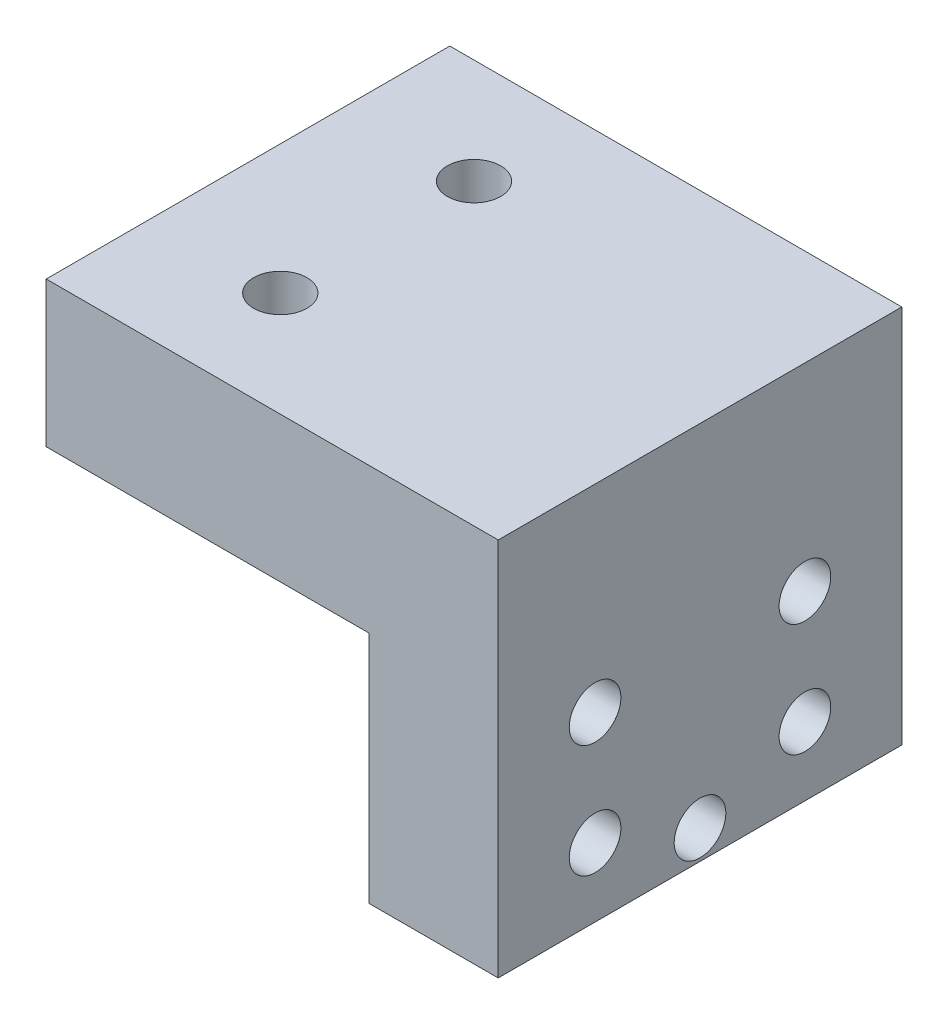
ISO-10303-21;
HEADER;
FILE_DESCRIPTION(('STEP AP214'),'2;1');
FILE_NAME('part.step','',(''),(''),'','','');
FILE_SCHEMA(('AUTOMOTIVE_DESIGN { 1 0 10303 214 1 1 1 1 }'));
ENDSEC;
DATA;
#1=APPLICATION_CONTEXT('core data for automotive mechanical design processes');
#2=APPLICATION_PROTOCOL_DEFINITION('international standard','automotive_design',2000,#1);
#3=PRODUCT_CONTEXT('',#1,'mechanical');
#4=PRODUCT('Part','Part','',(#3));
#5=PRODUCT_RELATED_PRODUCT_CATEGORY('part','',(#4));
#6=PRODUCT_DEFINITION_FORMATION('','',#4);
#7=PRODUCT_DEFINITION_CONTEXT('part definition',#1,'design');
#8=PRODUCT_DEFINITION('design','',#6,#7);
#9=PRODUCT_DEFINITION_SHAPE('','',#8);
#10=(LENGTH_UNIT() NAMED_UNIT(*) SI_UNIT(.MILLI.,.METRE.));
#11=(NAMED_UNIT(*) PLANE_ANGLE_UNIT() SI_UNIT($,.RADIAN.));
#12=(NAMED_UNIT(*) SI_UNIT($,.STERADIAN.) SOLID_ANGLE_UNIT());
#13=UNCERTAINTY_MEASURE_WITH_UNIT(LENGTH_MEASURE(1.E-05),#10,'distance_accuracy_value','');
#14=(GEOMETRIC_REPRESENTATION_CONTEXT(3) GLOBAL_UNCERTAINTY_ASSIGNED_CONTEXT((#13)) GLOBAL_UNIT_ASSIGNED_CONTEXT((#10,
#11,#12)) REPRESENTATION_CONTEXT('',''));
#15=CARTESIAN_POINT('',(0.,0.,0.));
#16=DIRECTION('',(0.,0.,1.));
#17=DIRECTION('',(1.,0.,0.));
#18=AXIS2_PLACEMENT_3D('',#15,#16,#17);
#19=CARTESIAN_POINT('',(-8.,14.5,25.));
#20=DIRECTION('',(1.,0.,0.));
#21=DIRECTION('',(0.,1.,0.));
#22=AXIS2_PLACEMENT_3D('',#19,#20,#21);
#23=PLANE('',#22);
#24=CARTESIAN_POINT('',(-8.,4.25,19.));
#25=DIRECTION('',(-1.,0.,0.));
#26=DIRECTION('',(0.,-1.,0.));
#27=AXIS2_PLACEMENT_3D('',#24,#25,#26);
#28=CIRCLE('',#27,1.6);
#29=CARTESIAN_POINT('',(-8.,2.64999999999999,19.));
#30=VERTEX_POINT('',#29);
#31=EDGE_CURVE('E255',#30,#30,#28,.T.);
#32=ORIENTED_EDGE('',*,*,#31,.F.);
#33=EDGE_LOOP('',(#32));
#34=FACE_BOUND('',#33,.T.);
#35=CARTESIAN_POINT('',(-8.,11.25,19.));
#36=DIRECTION('',(-1.,0.,0.));
#37=DIRECTION('',(0.,-1.,0.));
#38=AXIS2_PLACEMENT_3D('',#35,#36,#37);
#39=CIRCLE('',#38,1.6);
#40=CARTESIAN_POINT('',(-8.,9.65,19.));
#41=VERTEX_POINT('',#40);
#42=EDGE_CURVE('E252',#41,#41,#39,.T.);
#43=ORIENTED_EDGE('',*,*,#42,.F.);
#44=EDGE_LOOP('',(#43));
#45=FACE_BOUND('',#44,.T.);
#46=DIRECTION('',(0.,0.,-1.));
#47=VECTOR('',#46,1.);
#48=CARTESIAN_POINT('',(-8.,14.5,25.));
#49=LINE('',#48,#47);
#50=CARTESIAN_POINT('',(-8.,14.5,25.));
#51=VERTEX_POINT('',#50);
#52=CARTESIAN_POINT('',(-8.,14.5,14.7248595461287));
#53=VERTEX_POINT('',#52);
#54=EDGE_CURVE('E131',#51,#53,#49,.T.);
#55=ORIENTED_EDGE('',*,*,#54,.T.);
#56=DIRECTION('',(0.,-1.,0.));
#57=VECTOR('',#56,1.);
#58=CARTESIAN_POINT('',(-8.,22.9386017799159,14.7248595461287));
#59=LINE('',#58,#57);
#60=CARTESIAN_POINT('',(-8.,0.,14.7248595461287));
#61=VERTEX_POINT('',#60);
#62=EDGE_CURVE('E219',#53,#61,#59,.T.);
#63=ORIENTED_EDGE('',*,*,#62,.T.);
#64=DIRECTION('',(0.,0.,-1.));
#65=VECTOR('',#64,1.);
#66=CARTESIAN_POINT('',(-8.,0.,25.));
#67=LINE('',#66,#65);
#68=CARTESIAN_POINT('',(-8.,0.,25.));
#69=VERTEX_POINT('',#68);
#70=EDGE_CURVE('E152',#69,#61,#67,.T.);
#71=ORIENTED_EDGE('',*,*,#70,.F.);
#72=DIRECTION('',(0.,-1.,0.));
#73=VECTOR('',#72,1.);
#74=CARTESIAN_POINT('',(-8.,14.5,25.));
#75=LINE('',#74,#73);
#76=EDGE_CURVE('E64',#51,#69,#75,.T.);
#77=ORIENTED_EDGE('',*,*,#76,.F.);
#78=EDGE_LOOP('',(#55,#63,#71,#77));
#79=FACE_BOUND('',#78,.T.);
#80=ADVANCED_FACE('F34',(#34,#45,#79),#23,.F.);
#81=CARTESIAN_POINT('',(-8.,0.,25.));
#82=DIRECTION('',(0.,1.,0.));
#83=DIRECTION('',(0.,0.,1.));
#84=AXIS2_PLACEMENT_3D('',#81,#82,#83);
#85=PLANE('',#84);
#86=ORIENTED_EDGE('',*,*,#70,.T.);
#87=CARTESIAN_POINT('',(-5.7,0.,12.5));
#88=DIRECTION('',(0.,-1.,0.));
#89=DIRECTION('',(0.,0.,-1.));
#90=AXIS2_PLACEMENT_3D('',#87,#88,#89);
#91=CIRCLE('',#90,3.2);
#92=CARTESIAN_POINT('',(-8.,0.,10.2751404538713));
#93=VERTEX_POINT('',#92);
#94=EDGE_CURVE('E224',#93,#61,#91,.T.);
#95=ORIENTED_EDGE('',*,*,#94,.F.);
#96=CARTESIAN_POINT('',(-8.,0.,0.));
#97=VERTEX_POINT('',#96);
#98=EDGE_CURVE('E92',#93,#97,#67,.T.);
#99=ORIENTED_EDGE('',*,*,#98,.T.);
#100=DIRECTION('',(1.,0.,0.));
#101=VECTOR('',#100,1.);
#102=CARTESIAN_POINT('',(-8.,0.,0.));
#103=LINE('',#102,#101);
#104=CARTESIAN_POINT('',(0.,0.,0.));
#105=VERTEX_POINT('',#104);
#106=EDGE_CURVE('E139',#97,#105,#103,.T.);
#107=ORIENTED_EDGE('',*,*,#106,.T.);
#108=DIRECTION('',(0.,0.,-1.));
#109=VECTOR('',#108,1.);
#110=CARTESIAN_POINT('',(0.,0.,25.));
#111=LINE('',#110,#109);
#112=CARTESIAN_POINT('',(0.,0.,25.));
#113=VERTEX_POINT('',#112);
#114=EDGE_CURVE('E11',#113,#105,#111,.T.);
#115=ORIENTED_EDGE('',*,*,#114,.F.);
#116=DIRECTION('',(1.,0.,0.));
#117=VECTOR('',#116,1.);
#118=CARTESIAN_POINT('',(-8.,0.,25.));
#119=LINE('',#118,#117);
#120=EDGE_CURVE('E151',#69,#113,#119,.T.);
#121=ORIENTED_EDGE('',*,*,#120,.F.);
#122=EDGE_LOOP('',(#86,#95,#99,#107,#115,#121));
#123=FACE_BOUND('',#122,.T.);
#124=ADVANCED_FACE('F36',(#123),#85,.F.);
#125=CARTESIAN_POINT('',(0.,0.,25.));
#126=DIRECTION('',(-1.,0.,0.));
#127=DIRECTION('',(0.,0.,1.));
#128=AXIS2_PLACEMENT_3D('',#125,#126,#127);
#129=PLANE('',#128);
#130=CARTESIAN_POINT('',(0.,4.25,6.));
#131=DIRECTION('',(-1.,0.,0.));
#132=DIRECTION('',(0.,0.,1.));
#133=AXIS2_PLACEMENT_3D('',#130,#131,#132);
#134=CIRCLE('',#133,1.6);
#135=CARTESIAN_POINT('',(0.,4.25,7.6));
#136=VERTEX_POINT('',#135);
#137=EDGE_CURVE('E235',#136,#136,#134,.T.);
#138=ORIENTED_EDGE('',*,*,#137,.T.);
#139=EDGE_LOOP('',(#138));
#140=FACE_BOUND('',#139,.T.);
#141=CARTESIAN_POINT('',(0.,11.25,19.));
#142=DIRECTION('',(-1.,0.,0.));
#143=DIRECTION('',(0.,0.,1.));
#144=AXIS2_PLACEMENT_3D('',#141,#142,#143);
#145=CIRCLE('',#144,1.6);
#146=CARTESIAN_POINT('',(0.,11.25,20.6));
#147=VERTEX_POINT('',#146);
#148=EDGE_CURVE('E239',#147,#147,#145,.T.);
#149=ORIENTED_EDGE('',*,*,#148,.T.);
#150=EDGE_LOOP('',(#149));
#151=FACE_BOUND('',#150,.T.);
#152=CARTESIAN_POINT('',(0.,4.25,19.));
#153=DIRECTION('',(-1.,0.,0.));
#154=DIRECTION('',(0.,0.,1.));
#155=AXIS2_PLACEMENT_3D('',#152,#153,#154);
#156=CIRCLE('',#155,1.6);
#157=CARTESIAN_POINT('',(0.,4.25,20.6));
#158=VERTEX_POINT('',#157);
#159=EDGE_CURVE('E242',#158,#158,#156,.T.);
#160=ORIENTED_EDGE('',*,*,#159,.T.);
#161=EDGE_LOOP('',(#160));
#162=FACE_BOUND('',#161,.T.);
#163=CARTESIAN_POINT('',(0.,1.8,12.5));
#164=DIRECTION('',(-1.,0.,0.));
#165=DIRECTION('',(0.,0.,1.));
#166=AXIS2_PLACEMENT_3D('',#163,#164,#165);
#167=CIRCLE('',#166,1.6);
#168=CARTESIAN_POINT('',(0.,1.8,14.1));
#169=VERTEX_POINT('',#168);
#170=EDGE_CURVE('E245',#169,#169,#167,.T.);
#171=ORIENTED_EDGE('',*,*,#170,.T.);
#172=EDGE_LOOP('',(#171));
#173=FACE_BOUND('',#172,.T.);
#174=CARTESIAN_POINT('',(0.,11.25,6.));
#175=DIRECTION('',(-1.,0.,0.));
#176=DIRECTION('',(0.,0.,1.));
#177=AXIS2_PLACEMENT_3D('',#174,#175,#176);
#178=CIRCLE('',#177,1.6);
#179=CARTESIAN_POINT('',(0.,11.25,7.6));
#180=VERTEX_POINT('',#179);
#181=EDGE_CURVE('E248',#180,#180,#178,.T.);
#182=ORIENTED_EDGE('',*,*,#181,.T.);
#183=EDGE_LOOP('',(#182));
#184=FACE_BOUND('',#183,.T.);
#185=DIRECTION('',(0.,1.,0.));
#186=VECTOR('',#185,1.);
#187=CARTESIAN_POINT('',(0.,0.,0.));
#188=LINE('',#187,#186);
#189=CARTESIAN_POINT('',(0.,23.5,0.));
#190=VERTEX_POINT('',#189);
#191=EDGE_CURVE('E141',#105,#190,#188,.T.);
#192=ORIENTED_EDGE('',*,*,#191,.T.);
#193=DIRECTION('',(0.,0.,-1.));
#194=VECTOR('',#193,1.);
#195=CARTESIAN_POINT('',(0.,23.5,25.));
#196=LINE('',#195,#194);
#197=CARTESIAN_POINT('',(0.,23.5,25.));
#198=VERTEX_POINT('',#197);
#199=EDGE_CURVE('E47',#198,#190,#196,.T.);
#200=ORIENTED_EDGE('',*,*,#199,.F.);
#201=DIRECTION('',(0.,1.,0.));
#202=VECTOR('',#201,1.);
#203=CARTESIAN_POINT('',(0.,0.,25.));
#204=LINE('',#203,#202);
#205=EDGE_CURVE('E100',#113,#198,#204,.T.);
#206=ORIENTED_EDGE('',*,*,#205,.F.);
#207=ORIENTED_EDGE('',*,*,#114,.T.);
#208=EDGE_LOOP('',(#192,#200,#206,#207));
#209=FACE_BOUND('',#208,.T.);
#210=ADVANCED_FACE('F192',(#140,#151,#162,#173,#184,#209),#129,.F.);
#211=CARTESIAN_POINT('',(0.,23.5,25.));
#212=DIRECTION('',(0.,-1.,0.));
#213=DIRECTION('',(1.,0.,0.));
#214=AXIS2_PLACEMENT_3D('',#211,#212,#213);
#215=PLANE('',#214);
#216=CARTESIAN_POINT('',(-20.,23.5,6.5));
#217=DIRECTION('',(0.,1.,0.));
#218=DIRECTION('',(-1.,0.,0.));
#219=AXIS2_PLACEMENT_3D('',#216,#217,#218);
#220=CIRCLE('',#219,1.65);
#221=CARTESIAN_POINT('',(-21.65,23.5,6.5));
#222=VERTEX_POINT('',#221);
#223=EDGE_CURVE('E162',#222,#222,#220,.T.);
#224=ORIENTED_EDGE('',*,*,#223,.F.);
#225=EDGE_LOOP('',(#224));
#226=FACE_BOUND('',#225,.T.);
#227=CARTESIAN_POINT('',(-20.,23.5,18.5));
#228=DIRECTION('',(0.,1.,0.));
#229=DIRECTION('',(-1.,0.,0.));
#230=AXIS2_PLACEMENT_3D('',#227,#228,#229);
#231=CIRCLE('',#230,1.65);
#232=CARTESIAN_POINT('',(-21.65,23.5,18.5));
#233=VERTEX_POINT('',#232);
#234=EDGE_CURVE('E232',#233,#233,#231,.T.);
#235=ORIENTED_EDGE('',*,*,#234,.F.);
#236=EDGE_LOOP('',(#235));
#237=FACE_BOUND('',#236,.T.);
#238=DIRECTION('',(-1.,0.,0.));
#239=VECTOR('',#238,1.);
#240=CARTESIAN_POINT('',(0.,23.5,0.));
#241=LINE('',#240,#239);
#242=CARTESIAN_POINT('',(-28.,23.5,0.));
#243=VERTEX_POINT('',#242);
#244=EDGE_CURVE('E144',#190,#243,#241,.T.);
#245=ORIENTED_EDGE('',*,*,#244,.T.);
#246=DIRECTION('',(0.,0.,-1.));
#247=VECTOR('',#246,1.);
#248=CARTESIAN_POINT('',(-28.,23.5,25.));
#249=LINE('',#248,#247);
#250=CARTESIAN_POINT('',(-28.,23.5,25.));
#251=VERTEX_POINT('',#250);
#252=EDGE_CURVE('E130',#251,#243,#249,.T.);
#253=ORIENTED_EDGE('',*,*,#252,.F.);
#254=DIRECTION('',(-1.,0.,0.));
#255=VECTOR('',#254,1.);
#256=CARTESIAN_POINT('',(0.,23.5,25.));
#257=LINE('',#256,#255);
#258=EDGE_CURVE('E117',#198,#251,#257,.T.);
#259=ORIENTED_EDGE('',*,*,#258,.F.);
#260=ORIENTED_EDGE('',*,*,#199,.T.);
#261=EDGE_LOOP('',(#245,#253,#259,#260));
#262=FACE_BOUND('',#261,.T.);
#263=ADVANCED_FACE('F290',(#226,#237,#262),#215,.F.);
#264=CARTESIAN_POINT('',(-28.,23.5,25.));
#265=DIRECTION('',(1.,0.,0.));
#266=DIRECTION('',(0.,1.,0.));
#267=AXIS2_PLACEMENT_3D('',#264,#265,#266);
#268=PLANE('',#267);
#269=DIRECTION('',(0.,-1.,0.));
#270=VECTOR('',#269,1.);
#271=CARTESIAN_POINT('',(-28.,23.5,0.));
#272=LINE('',#271,#270);
#273=CARTESIAN_POINT('',(-28.,14.5,0.));
#274=VERTEX_POINT('',#273);
#275=EDGE_CURVE('E126',#243,#274,#272,.T.);
#276=ORIENTED_EDGE('',*,*,#275,.T.);
#277=DIRECTION('',(0.,0.,-1.));
#278=VECTOR('',#277,1.);
#279=CARTESIAN_POINT('',(-28.,14.5,25.));
#280=LINE('',#279,#278);
#281=CARTESIAN_POINT('',(-28.,14.5,25.));
#282=VERTEX_POINT('',#281);
#283=EDGE_CURVE('E123',#282,#274,#280,.T.);
#284=ORIENTED_EDGE('',*,*,#283,.F.);
#285=DIRECTION('',(0.,-1.,0.));
#286=VECTOR('',#285,1.);
#287=CARTESIAN_POINT('',(-28.,23.5,25.));
#288=LINE('',#287,#286);
#289=EDGE_CURVE('E110',#251,#282,#288,.T.);
#290=ORIENTED_EDGE('',*,*,#289,.F.);
#291=ORIENTED_EDGE('',*,*,#252,.T.);
#292=EDGE_LOOP('',(#276,#284,#290,#291));
#293=FACE_BOUND('',#292,.T.);
#294=ADVANCED_FACE('F124',(#293),#268,.F.);
#295=CARTESIAN_POINT('',(-28.,14.5,25.));
#296=DIRECTION('',(0.,1.,0.));
#297=DIRECTION('',(0.,0.,1.));
#298=AXIS2_PLACEMENT_3D('',#295,#296,#297);
#299=PLANE('',#298);
#300=CARTESIAN_POINT('',(-20.,14.5,6.5));
#301=DIRECTION('',(0.,1.,0.));
#302=DIRECTION('',(0.,0.,1.));
#303=AXIS2_PLACEMENT_3D('',#300,#301,#302);
#304=CIRCLE('',#303,1.65);
#305=CARTESIAN_POINT('',(-20.,14.5,8.15));
#306=VERTEX_POINT('',#305);
#307=EDGE_CURVE('E142',#306,#306,#304,.T.);
#308=ORIENTED_EDGE('',*,*,#307,.T.);
#309=EDGE_LOOP('',(#308));
#310=FACE_BOUND('',#309,.T.);
#311=CARTESIAN_POINT('',(-20.,14.5,18.5));
#312=DIRECTION('',(0.,1.,0.));
#313=DIRECTION('',(0.,0.,1.));
#314=AXIS2_PLACEMENT_3D('',#311,#312,#313);
#315=CIRCLE('',#314,1.65);
#316=CARTESIAN_POINT('',(-20.,14.5,20.15));
#317=VERTEX_POINT('',#316);
#318=EDGE_CURVE('E160',#317,#317,#315,.T.);
#319=ORIENTED_EDGE('',*,*,#318,.T.);
#320=EDGE_LOOP('',(#319));
#321=FACE_BOUND('',#320,.T.);
#322=DIRECTION('',(1.,0.,0.));
#323=VECTOR('',#322,1.);
#324=CARTESIAN_POINT('',(-28.,14.5,0.));
#325=LINE('',#324,#323);
#326=CARTESIAN_POINT('',(-8.,14.5,0.));
#327=VERTEX_POINT('',#326);
#328=EDGE_CURVE('E147',#274,#327,#325,.T.);
#329=ORIENTED_EDGE('',*,*,#328,.T.);
#330=CARTESIAN_POINT('',(-8.,14.5,10.2751404538713));
#331=VERTEX_POINT('',#330);
#332=EDGE_CURVE('E155',#331,#327,#49,.T.);
#333=ORIENTED_EDGE('',*,*,#332,.F.);
#334=CARTESIAN_POINT('',(-5.7,14.5,12.5));
#335=DIRECTION('',(0.,1.,0.));
#336=DIRECTION('',(0.,0.,1.));
#337=AXIS2_PLACEMENT_3D('',#334,#335,#336);
#338=CIRCLE('',#337,3.2);
#339=EDGE_CURVE('E55',#331,#53,#338,.F.);
#340=ORIENTED_EDGE('',*,*,#339,.T.);
#341=ORIENTED_EDGE('',*,*,#54,.F.);
#342=DIRECTION('',(1.,0.,0.));
#343=VECTOR('',#342,1.);
#344=CARTESIAN_POINT('',(-28.,14.5,25.));
#345=LINE('',#344,#343);
#346=EDGE_CURVE('E114',#282,#51,#345,.T.);
#347=ORIENTED_EDGE('',*,*,#346,.F.);
#348=ORIENTED_EDGE('',*,*,#283,.T.);
#349=EDGE_LOOP('',(#329,#333,#340,#341,#347,#348));
#350=FACE_BOUND('',#349,.T.);
#351=ADVANCED_FACE('F133',(#310,#321,#350),#299,.F.);
#352=CARTESIAN_POINT('',(-8.,4.25,6.));
#353=DIRECTION('',(-1.,0.,0.));
#354=DIRECTION('',(0.,-1.,0.));
#355=AXIS2_PLACEMENT_3D('',#352,#353,#354);
#356=CIRCLE('',#355,1.6);
#357=CARTESIAN_POINT('',(-8.,2.64999999999999,6.));
#358=VERTEX_POINT('',#357);
#359=EDGE_CURVE('E207',#358,#358,#356,.T.);
#360=ORIENTED_EDGE('',*,*,#359,.F.);
#361=EDGE_LOOP('',(#360));
#362=FACE_BOUND('',#361,.T.);
#363=CARTESIAN_POINT('',(-8.,11.25,6.));
#364=DIRECTION('',(-1.,0.,0.));
#365=DIRECTION('',(0.,-1.,0.));
#366=AXIS2_PLACEMENT_3D('',#363,#364,#365);
#367=CIRCLE('',#366,1.6);
#368=CARTESIAN_POINT('',(-8.,9.65,6.));
#369=VERTEX_POINT('',#368);
#370=EDGE_CURVE('E211',#369,#369,#367,.T.);
#371=ORIENTED_EDGE('',*,*,#370,.F.);
#372=EDGE_LOOP('',(#371));
#373=FACE_BOUND('',#372,.T.);
#374=ORIENTED_EDGE('',*,*,#98,.F.);
#375=DIRECTION('',(0.,-1.,0.));
#376=VECTOR('',#375,1.);
#377=CARTESIAN_POINT('',(-8.,22.9386017799159,10.2751404538713));
#378=LINE('',#377,#376);
#379=EDGE_CURVE('E213',#331,#93,#378,.T.);
#380=ORIENTED_EDGE('',*,*,#379,.F.);
#381=ORIENTED_EDGE('',*,*,#332,.T.);
#382=DIRECTION('',(0.,-1.,0.));
#383=VECTOR('',#382,1.);
#384=CARTESIAN_POINT('',(-8.,14.5,0.));
#385=LINE('',#384,#383);
#386=EDGE_CURVE('E149',#327,#97,#385,.T.);
#387=ORIENTED_EDGE('',*,*,#386,.T.);
#388=EDGE_LOOP('',(#374,#380,#381,#387));
#389=FACE_BOUND('',#388,.T.);
#390=ADVANCED_FACE('F188',(#362,#373,#389),#23,.F.);
#391=CARTESIAN_POINT('',(0.,0.,25.));
#392=DIRECTION('',(0.,0.,1.));
#393=DIRECTION('',(1.,0.,0.));
#394=AXIS2_PLACEMENT_3D('',#391,#392,#393);
#395=PLANE('',#394);
#396=ORIENTED_EDGE('',*,*,#120,.T.);
#397=ORIENTED_EDGE('',*,*,#205,.T.);
#398=ORIENTED_EDGE('',*,*,#258,.T.);
#399=ORIENTED_EDGE('',*,*,#289,.T.);
#400=ORIENTED_EDGE('',*,*,#346,.T.);
#401=ORIENTED_EDGE('',*,*,#76,.T.);
#402=EDGE_LOOP('',(#396,#397,#398,#399,#400,#401));
#403=FACE_BOUND('',#402,.T.);
#404=ADVANCED_FACE('F112',(#403),#395,.T.);
#405=CARTESIAN_POINT('',(0.,0.,0.));
#406=DIRECTION('',(0.,0.,1.));
#407=DIRECTION('',(1.,0.,0.));
#408=AXIS2_PLACEMENT_3D('',#405,#406,#407);
#409=PLANE('',#408);
#410=ORIENTED_EDGE('',*,*,#106,.F.);
#411=ORIENTED_EDGE('',*,*,#386,.F.);
#412=ORIENTED_EDGE('',*,*,#328,.F.);
#413=ORIENTED_EDGE('',*,*,#275,.F.);
#414=ORIENTED_EDGE('',*,*,#244,.F.);
#415=ORIENTED_EDGE('',*,*,#191,.F.);
#416=EDGE_LOOP('',(#410,#411,#412,#413,#414,#415));
#417=FACE_BOUND('',#416,.T.);
#418=ADVANCED_FACE('F181',(#417),#409,.F.);
#419=CARTESIAN_POINT('',(-20.,-9.50000000000001,18.5));
#420=DIRECTION('',(0.,1.,0.));
#421=DIRECTION('',(-1.,0.,0.));
#422=AXIS2_PLACEMENT_3D('',#419,#420,#421);
#423=CYLINDRICAL_SURFACE('',#422,1.65);
#424=ORIENTED_EDGE('',*,*,#234,.T.);
#425=EDGE_LOOP('',(#424));
#426=FACE_BOUND('',#425,.T.);
#427=ORIENTED_EDGE('',*,*,#318,.F.);
#428=EDGE_LOOP('',(#427));
#429=FACE_BOUND('',#428,.T.);
#430=ADVANCED_FACE('F171',(#426,#429),#423,.F.);
#431=CARTESIAN_POINT('',(-20.,-9.50000000000001,6.5));
#432=DIRECTION('',(0.,1.,0.));
#433=DIRECTION('',(-1.,0.,0.));
#434=AXIS2_PLACEMENT_3D('',#431,#432,#433);
#435=CYLINDRICAL_SURFACE('',#434,1.65);
#436=ORIENTED_EDGE('',*,*,#223,.T.);
#437=EDGE_LOOP('',(#436));
#438=FACE_BOUND('',#437,.T.);
#439=ORIENTED_EDGE('',*,*,#307,.F.);
#440=EDGE_LOOP('',(#439));
#441=FACE_BOUND('',#440,.T.);
#442=ADVANCED_FACE('F168',(#438,#441),#435,.F.);
#443=CARTESIAN_POINT('',(25.,11.25,6.));
#444=DIRECTION('',(-1.,0.,0.));
#445=DIRECTION('',(0.,-1.,0.));
#446=AXIS2_PLACEMENT_3D('',#443,#444,#445);
#447=CYLINDRICAL_SURFACE('',#446,1.6);
#448=ORIENTED_EDGE('',*,*,#370,.T.);
#449=EDGE_LOOP('',(#448));
#450=FACE_BOUND('',#449,.T.);
#451=ORIENTED_EDGE('',*,*,#181,.F.);
#452=EDGE_LOOP('',(#451));
#453=FACE_BOUND('',#452,.T.);
#454=ADVANCED_FACE('F170',(#450,#453),#447,.F.);
#455=CARTESIAN_POINT('',(25.,1.8,12.5));
#456=DIRECTION('',(-1.,0.,0.));
#457=DIRECTION('',(0.,-1.,0.));
#458=AXIS2_PLACEMENT_3D('',#455,#456,#457);
#459=CYLINDRICAL_SURFACE('',#458,1.6);
#460=CARTESIAN_POINT('',(-2.5,0.199999999999995,12.5));
#461=CARTESIAN_POINT('',(-2.50000458551934,0.200005283707502,12.584115140722));
#462=CARTESIAN_POINT('',(-2.5033521436839,0.206672116993685,12.6683305595161));
#463=CARTESIAN_POINT('',(-2.51641350340549,0.233044608546456,12.8342723764302));
#464=CARTESIAN_POINT('',(-2.52613939473729,0.2527750287965,12.9159937387418));
#465=CARTESIAN_POINT('',(-2.550939529546,0.304310093786602,13.0742936718087));
#466=CARTESIAN_POINT('',(-2.5659929731594,0.336067814796743,13.1508908847026));
#467=CARTESIAN_POINT('',(-2.60006757574782,0.410512994183971,13.2975561868906));
#468=CARTESIAN_POINT('',(-2.6190884218636,0.453199590798178,13.3676247903841));
#469=CARTESIAN_POINT('',(-2.66069986787101,0.551227599176451,13.5040125084191));
#470=CARTESIAN_POINT('',(-2.68343681395941,0.607178366783416,13.5698483377954));
#471=CARTESIAN_POINT('',(-2.72944047605211,0.728834366795253,13.6916471117872));
#472=CARTESIAN_POINT('',(-2.75270758065545,0.794546962835901,13.7476025329708));
#473=CARTESIAN_POINT('',(-2.79921678084244,0.939973359237405,13.8524032007204));
#474=CARTESIAN_POINT('',(-2.82231700847789,1.02037775735346,13.9003605368826));
#475=CARTESIAN_POINT('',(-2.86342433964287,1.18938773757794,13.9818691630251));
#476=CARTESIAN_POINT('',(-2.88143507828817,1.2779874059564,14.0154307439461));
#477=CARTESIAN_POINT('',(-2.90867412739507,1.45546416867507,14.0650119075017));
#478=CARTESIAN_POINT('',(-2.91836365466059,1.54400712330783,14.0819613713287));
#479=CARTESIAN_POINT('',(-2.92908976082356,1.72316614044716,14.1006831892942));
#480=CARTESIAN_POINT('',(-2.93013489050739,1.81378006539384,14.1024705413969));
#481=CARTESIAN_POINT('',(-2.92382511588403,1.98285763890459,14.0914996594757));
#482=CARTESIAN_POINT('',(-2.91745978140778,2.06147844995688,14.0804552952589));
#483=CARTESIAN_POINT('',(-2.8987803402584,2.21555505499687,14.0471037584911));
#484=CARTESIAN_POINT('',(-2.88646433869158,2.2910098324885,14.0247929982362));
#485=CARTESIAN_POINT('',(-2.85700037739614,2.43876661210505,13.9691356486176));
#486=CARTESIAN_POINT('',(-2.83974654937602,2.51095423805726,13.9355441073856));
#487=CARTESIAN_POINT('',(-2.80234553149754,2.64901486814401,13.8584667002688));
#488=CARTESIAN_POINT('',(-2.78219704351695,2.71488501696014,13.8149763901));
#489=CARTESIAN_POINT('',(-2.73818947354743,2.84723400438916,13.7129056878605));
#490=CARTESIAN_POINT('',(-2.71418383621206,2.91273099772185,13.6531111333909));
#491=CARTESIAN_POINT('',(-2.66723802719349,3.03317666974544,13.5232889259862));
#492=CARTESIAN_POINT('',(-2.64429836865919,3.08812030725421,13.4532564105189));
#493=CARTESIAN_POINT('',(-2.60076820347258,3.18829705764756,13.300826409331));
#494=CARTESIAN_POINT('',(-2.58033625340789,3.23296075591318,13.2180057465591));
#495=CARTESIAN_POINT('',(-2.54547390206012,3.30735524646881,13.0447459447821));
#496=CARTESIAN_POINT('',(-2.53103873690315,3.33709789602426,12.9543129220244));
#497=CARTESIAN_POINT('',(-2.51081066013703,3.37836064594668,12.7764263866571));
#498=CARTESIAN_POINT('',(-2.50440098717904,3.39118597719485,12.6893464488773));
#499=CARTESIAN_POINT('',(-2.49883178465434,3.40234356981518,12.514047359919));
#500=CARTESIAN_POINT('',(-2.4996688204589,3.40068269702315,12.4258287682081));
#501=CARTESIAN_POINT('',(-2.50814092394504,3.38366929853001,12.2580272448224));
#502=CARTESIAN_POINT('',(-2.51524406898931,3.36938794763201,12.1783049471201));
#503=CARTESIAN_POINT('',(-2.53484525896256,3.3292190849678,12.0225489723169));
#504=CARTESIAN_POINT('',(-2.54734389864941,3.30333029367441,11.9465157028943));
#505=CARTESIAN_POINT('',(-2.57705197738259,3.24000245370715,11.7977782264807));
#506=CARTESIAN_POINT('',(-2.59438589168591,3.20225431981394,11.7252313647907));
#507=CARTESIAN_POINT('',(-2.63209641092132,3.11662794296549,11.5872618212812));
#508=CARTESIAN_POINT('',(-2.65247431092899,3.06874538464736,11.5218421923575));
#509=CARTESIAN_POINT('',(-2.69666845862083,2.95878331947085,11.3931716971373));
#510=CARTESIAN_POINT('',(-2.72062584250401,2.89577141048776,11.3307646754896));
#511=CARTESIAN_POINT('',(-2.76780173425888,2.76011975795563,11.2170298862098));
#512=CARTESIAN_POINT('',(-2.79101972159925,2.68747340984333,11.165709782861));
#513=CARTESIAN_POINT('',(-2.83518092469617,2.53017015332324,11.0732673368336));
#514=CARTESIAN_POINT('',(-2.85595952657503,2.44510197424883,11.0327592067196));
#515=CARTESIAN_POINT('',(-2.89081484329385,2.26798389188005,10.9670674785045));
#516=CARTESIAN_POINT('',(-2.904900188452,2.17594315765297,10.9418641346128));
#517=CARTESIAN_POINT('',(-2.92301598358717,1.99694364338447,10.909821300053));
#518=CARTESIAN_POINT('',(-2.92788186455896,1.91034519450361,10.9014512057513));
#519=CARTESIAN_POINT('',(-2.92935432573435,1.73688469253676,10.8988973529981));
#520=CARTESIAN_POINT('',(-2.92596448597776,1.65002277001942,10.9047074454028));
#521=CARTESIAN_POINT('',(-2.91219420718278,1.4872263975465,10.9289181990507));
#522=CARTESIAN_POINT('',(-2.90251048827747,1.41103924776841,10.9460666970511));
#523=CARTESIAN_POINT('',(-2.87806374099756,1.26270700892101,10.9909194268409));
#524=CARTESIAN_POINT('',(-2.86329907888531,1.19056322865275,11.0186270541441));
#525=CARTESIAN_POINT('',(-2.82914351416743,1.04700023842154,11.0858948075191));
#526=CARTESIAN_POINT('',(-2.80950844166527,0.975955357073551,11.1261261794949));
#527=CARTESIAN_POINT('',(-2.76823469384224,0.841160742109983,11.2165584453802));
#528=CARTESIAN_POINT('',(-2.74659497927023,0.777414831166217,11.2667645260135));
#529=CARTESIAN_POINT('',(-2.70060282947053,0.650972828232516,11.3828746773418));
#530=CARTESIAN_POINT('',(-2.67624026709395,0.58934543623953,11.4499449232044));
#531=CARTESIAN_POINT('',(-2.62995596384111,0.477979226503564,11.5941523100269));
#532=CARTESIAN_POINT('',(-2.60803554198088,0.428246816848146,11.6712948427117));
#533=CARTESIAN_POINT('',(-2.5688318469354,0.342021819660684,11.8345094451473));
#534=CARTESIAN_POINT('',(-2.55158245609707,0.305625329221647,11.9206407939572));
#535=CARTESIAN_POINT('',(-2.52397853921621,0.248306931588141,12.0988126381791));
#536=CARTESIAN_POINT('',(-2.51360442619092,0.227341045110854,12.1908355206574));
#537=CARTESIAN_POINT('',(-2.50487260938435,0.209764142262809,12.3198368856146));
#538=CARTESIAN_POINT('',(-2.50305015455599,0.206107774613851,12.3557409928935));
#539=CARTESIAN_POINT('',(-2.50061284837095,0.20122453517746,12.4277572291119));
#540=CARTESIAN_POINT('',(-2.49999803034591,0.199997730447662,12.4638693637654));
#541=CARTESIAN_POINT('',(-2.5,0.199999999999995,12.5));
#542=B_SPLINE_CURVE_WITH_KNOTS('',3,(#460,#461,#462,#463,#464,#465,#466,#467,#468,#469,#470,
#471,#472,#473,#474,#475,#476,#477,#478,#479,#480,#481,#482,#483,#484,#485,#486,#487,#488,#489,
#490,#491,#492,#493,#494,#495,#496,#497,#498,#499,#500,#501,#502,#503,#504,#505,#506,#507,#508,
#509,#510,#511,#512,#513,#514,#515,#516,#517,#518,#519,#520,#521,#522,#523,#524,#525,#526,#527,
#528,#529,#530,#531,#532,#533,#534,#535,#536,#537,#538,#539,#540,#541),.UNSPECIFIED.,.T.,.F.,(4,
2,2,2,2,2,2,2,2,2,2,2,2,2,2,2,2,2,2,2,2,2,2,2,2,2,2,2,2,2,2,2,2,2,2,2,2,2,2,2,4),(0.,
0.252198811872467,0.504877039534716,0.756579448787677,1.00826201693051,1.27517081394894,
1.54228198024646,1.83010762289204,2.1177271663725,2.38812819424368,2.65826171726433,
2.89609139854913,3.13399686281086,3.3774438426958,3.62100034016355,3.89543906134206,
4.17000855357898,4.45732835543105,4.74441947059648,5.00773264754153,5.27092103218362,
5.51371050409795,5.75652674609491,6.00628569644639,6.25615121197344,6.53055377031071,
6.80514541784691,7.09303491458762,7.38055219112722,7.64046892004875,7.90027295783486,
8.1353268839817,8.37045646061363,8.6213833084846,8.8724409782981,9.15400388411475,
9.43571813409994,9.71942421861644,10.0023185379384,10.1106444821427,10.2189734161771),.UNSPECIFIED.);
#543=CARTESIAN_POINT('',(-2.5,0.199999999999995,12.5));
#544=VERTEX_POINT('',#543);
#545=EDGE_CURVE('E38',#544,#544,#542,.T.);
#546=ORIENTED_EDGE('',*,*,#545,.T.);
#547=EDGE_LOOP('',(#546));
#548=FACE_BOUND('',#547,.T.);
#549=ORIENTED_EDGE('',*,*,#170,.F.);
#550=EDGE_LOOP('',(#549));
#551=FACE_BOUND('',#550,.T.);
#552=ADVANCED_FACE('F178',(#548,#551),#459,.F.);
#553=CARTESIAN_POINT('',(25.,4.25,19.));
#554=DIRECTION('',(-1.,0.,0.));
#555=DIRECTION('',(0.,-1.,0.));
#556=AXIS2_PLACEMENT_3D('',#553,#554,#555);
#557=CYLINDRICAL_SURFACE('',#556,1.6);
#558=ORIENTED_EDGE('',*,*,#31,.T.);
#559=EDGE_LOOP('',(#558));
#560=FACE_BOUND('',#559,.T.);
#561=ORIENTED_EDGE('',*,*,#159,.F.);
#562=EDGE_LOOP('',(#561));
#563=FACE_BOUND('',#562,.T.);
#564=ADVANCED_FACE('F275',(#560,#563),#557,.F.);
#565=CARTESIAN_POINT('',(25.,11.25,19.));
#566=DIRECTION('',(-1.,0.,0.));
#567=DIRECTION('',(0.,-1.,0.));
#568=AXIS2_PLACEMENT_3D('',#565,#566,#567);
#569=CYLINDRICAL_SURFACE('',#568,1.6);
#570=ORIENTED_EDGE('',*,*,#42,.T.);
#571=EDGE_LOOP('',(#570));
#572=FACE_BOUND('',#571,.T.);
#573=ORIENTED_EDGE('',*,*,#148,.F.);
#574=EDGE_LOOP('',(#573));
#575=FACE_BOUND('',#574,.T.);
#576=ADVANCED_FACE('F270',(#572,#575),#569,.F.);
#577=CARTESIAN_POINT('',(25.,4.25,6.));
#578=DIRECTION('',(-1.,0.,0.));
#579=DIRECTION('',(0.,-1.,0.));
#580=AXIS2_PLACEMENT_3D('',#577,#578,#579);
#581=CYLINDRICAL_SURFACE('',#580,1.6);
#582=ORIENTED_EDGE('',*,*,#359,.T.);
#583=EDGE_LOOP('',(#582));
#584=FACE_BOUND('',#583,.T.);
#585=ORIENTED_EDGE('',*,*,#137,.F.);
#586=EDGE_LOOP('',(#585));
#587=FACE_BOUND('',#586,.T.);
#588=ADVANCED_FACE('F266',(#584,#587),#581,.F.);
#589=CARTESIAN_POINT('',(-5.7,22.9386017799159,12.5));
#590=DIRECTION('',(0.,-1.,0.));
#591=DIRECTION('',(0.,0.,-1.));
#592=AXIS2_PLACEMENT_3D('',#589,#590,#591);
#593=CYLINDRICAL_SURFACE('',#592,3.2);
#594=ORIENTED_EDGE('',*,*,#379,.T.);
#595=ORIENTED_EDGE('',*,*,#94,.T.);
#596=ORIENTED_EDGE('',*,*,#62,.F.);
#597=ORIENTED_EDGE('',*,*,#339,.F.);
#598=EDGE_LOOP('',(#594,#595,#596,#597));
#599=FACE_BOUND('',#598,.T.);
#600=ORIENTED_EDGE('',*,*,#545,.F.);
#601=EDGE_LOOP('',(#600));
#602=FACE_BOUND('',#601,.T.);
#603=ADVANCED_FACE('F222',(#599,#602),#593,.F.);
#604=CLOSED_SHELL('',(#80,#124,#210,#263,#294,#351,#390,#404,#418,#430,#442,#454,#552,#564,#576,
#588,#603));
#605=MANIFOLD_SOLID_BREP('B2',#604);
#606=ADVANCED_BREP_SHAPE_REPRESENTATION('',(#18,#605),#14);
#607=SHAPE_DEFINITION_REPRESENTATION(#9,#606);
ENDSEC;
END-ISO-10303-21;
